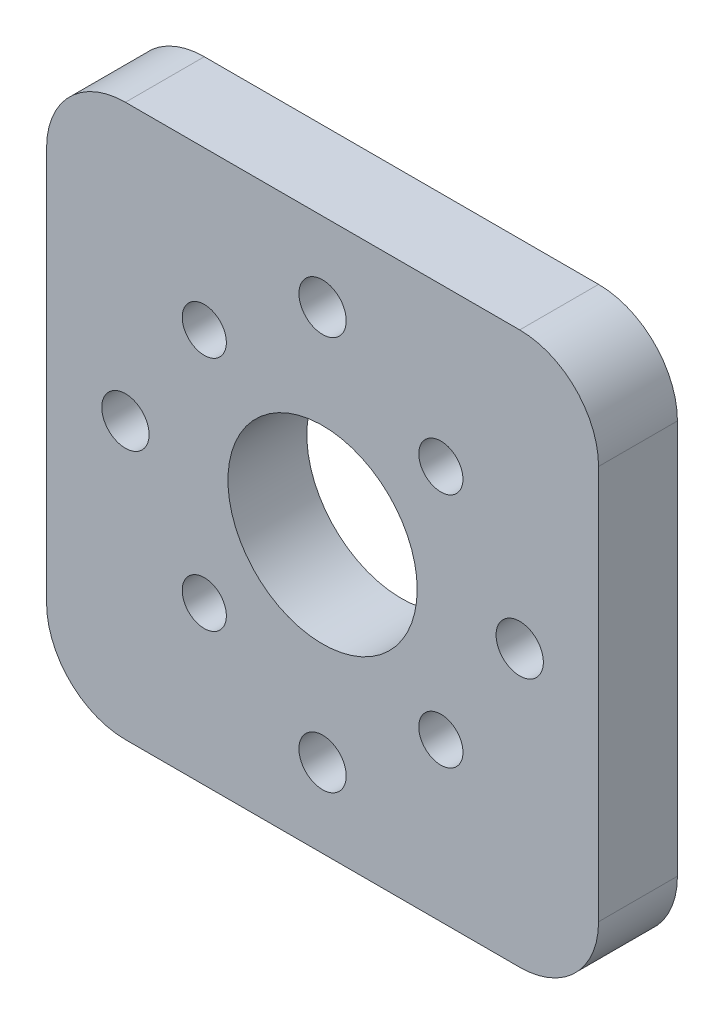
ISO-10303-21;
HEADER;
FILE_DESCRIPTION(('STEP AP214'),'2;1');
FILE_NAME('part.step','',(''),(''),'','','');
FILE_SCHEMA(('AUTOMOTIVE_DESIGN { 1 0 10303 214 1 1 1 1 }'));
ENDSEC;
DATA;
#1=APPLICATION_CONTEXT('core data for automotive mechanical design processes');
#2=APPLICATION_PROTOCOL_DEFINITION('international standard','automotive_design',2000,#1);
#3=PRODUCT_CONTEXT('',#1,'mechanical');
#4=PRODUCT('Part','Part','',(#3));
#5=PRODUCT_RELATED_PRODUCT_CATEGORY('part','',(#4));
#6=PRODUCT_DEFINITION_FORMATION('','',#4);
#7=PRODUCT_DEFINITION_CONTEXT('part definition',#1,'design');
#8=PRODUCT_DEFINITION('design','',#6,#7);
#9=PRODUCT_DEFINITION_SHAPE('','',#8);
#10=(LENGTH_UNIT() NAMED_UNIT(*) SI_UNIT(.MILLI.,.METRE.));
#11=(NAMED_UNIT(*) PLANE_ANGLE_UNIT() SI_UNIT($,.RADIAN.));
#12=(NAMED_UNIT(*) SI_UNIT($,.STERADIAN.) SOLID_ANGLE_UNIT());
#13=UNCERTAINTY_MEASURE_WITH_UNIT(LENGTH_MEASURE(1.E-05),#10,'distance_accuracy_value','');
#14=(GEOMETRIC_REPRESENTATION_CONTEXT(3) GLOBAL_UNCERTAINTY_ASSIGNED_CONTEXT((#13)) GLOBAL_UNIT_ASSIGNED_CONTEXT((#10,
#11,#12)) REPRESENTATION_CONTEXT('',''));
#15=CARTESIAN_POINT('',(0.,0.,0.));
#16=DIRECTION('',(0.,0.,1.));
#17=DIRECTION('',(1.,0.,0.));
#18=AXIS2_PLACEMENT_3D('',#15,#16,#17);
#19=CARTESIAN_POINT('',(0.,0.,5.));
#20=DIRECTION('',(0.,0.,1.));
#21=DIRECTION('',(1.,0.,0.));
#22=AXIS2_PLACEMENT_3D('',#19,#20,#21);
#23=PLANE('',#22);
#24=CARTESIAN_POINT('',(7.5,-7.5,5.));
#25=DIRECTION('',(0.,0.,1.));
#26=DIRECTION('',(1.,0.,0.));
#27=AXIS2_PLACEMENT_3D('',#24,#25,#26);
#28=CIRCLE('',#27,1.4);
#29=CARTESIAN_POINT('',(8.9,-7.5,5.));
#30=VERTEX_POINT('',#29);
#31=EDGE_CURVE('E222',#30,#30,#28,.T.);
#32=ORIENTED_EDGE('',*,*,#31,.F.);
#33=EDGE_LOOP('',(#32));
#34=FACE_BOUND('',#33,.T.);
#35=CARTESIAN_POINT('',(-7.5,7.5,5.));
#36=DIRECTION('',(0.,0.,1.));
#37=DIRECTION('',(1.,0.,0.));
#38=AXIS2_PLACEMENT_3D('',#35,#36,#37);
#39=CIRCLE('',#38,1.4);
#40=CARTESIAN_POINT('',(-6.1,7.5,5.));
#41=VERTEX_POINT('',#40);
#42=EDGE_CURVE('E210',#41,#41,#39,.T.);
#43=ORIENTED_EDGE('',*,*,#42,.F.);
#44=EDGE_LOOP('',(#43));
#45=FACE_BOUND('',#44,.T.);
#46=CARTESIAN_POINT('',(-12.5,0.,5.));
#47=DIRECTION('',(0.,0.,1.));
#48=DIRECTION('',(1.,0.,0.));
#49=AXIS2_PLACEMENT_3D('',#46,#47,#48);
#50=CIRCLE('',#49,1.5);
#51=CARTESIAN_POINT('',(-11.,0.,5.));
#52=VERTEX_POINT('',#51);
#53=EDGE_CURVE('E198',#52,#52,#50,.T.);
#54=ORIENTED_EDGE('',*,*,#53,.F.);
#55=EDGE_LOOP('',(#54));
#56=FACE_BOUND('',#55,.T.);
#57=CARTESIAN_POINT('',(12.5,0.,5.));
#58=DIRECTION('',(0.,0.,1.));
#59=DIRECTION('',(1.,0.,0.));
#60=AXIS2_PLACEMENT_3D('',#57,#58,#59);
#61=CIRCLE('',#60,1.5);
#62=CARTESIAN_POINT('',(14.,0.,5.));
#63=VERTEX_POINT('',#62);
#64=EDGE_CURVE('E187',#63,#63,#61,.T.);
#65=ORIENTED_EDGE('',*,*,#64,.F.);
#66=EDGE_LOOP('',(#65));
#67=FACE_BOUND('',#66,.T.);
#68=DIRECTION('',(1.,0.,0.));
#69=VECTOR('',#68,1.);
#70=CARTESIAN_POINT('',(-17.5,-17.5,5.));
#71=LINE('',#70,#69);
#72=CARTESIAN_POINT('',(-12.5,-17.5,5.));
#73=VERTEX_POINT('',#72);
#74=CARTESIAN_POINT('',(12.5,-17.5,5.));
#75=VERTEX_POINT('',#74);
#76=EDGE_CURVE('E143',#73,#75,#71,.T.);
#77=ORIENTED_EDGE('',*,*,#76,.T.);
#78=CARTESIAN_POINT('',(12.5,-12.5,5.));
#79=DIRECTION('',(0.,0.,1.));
#80=DIRECTION('',(1.,0.,0.));
#81=AXIS2_PLACEMENT_3D('',#78,#79,#80);
#82=CIRCLE('',#81,5.);
#83=CARTESIAN_POINT('',(17.5,-12.5,5.));
#84=VERTEX_POINT('',#83);
#85=EDGE_CURVE('E161',#75,#84,#82,.T.);
#86=ORIENTED_EDGE('',*,*,#85,.T.);
#87=DIRECTION('',(0.,1.,0.));
#88=VECTOR('',#87,1.);
#89=CARTESIAN_POINT('',(17.5,17.5,5.));
#90=LINE('',#89,#88);
#91=CARTESIAN_POINT('',(17.5,12.5,5.));
#92=VERTEX_POINT('',#91);
#93=EDGE_CURVE('E125',#84,#92,#90,.T.);
#94=ORIENTED_EDGE('',*,*,#93,.T.);
#95=CARTESIAN_POINT('',(12.5,12.5,5.));
#96=DIRECTION('',(0.,0.,1.));
#97=DIRECTION('',(1.,0.,0.));
#98=AXIS2_PLACEMENT_3D('',#95,#96,#97);
#99=CIRCLE('',#98,5.);
#100=CARTESIAN_POINT('',(12.5,17.5,5.));
#101=VERTEX_POINT('',#100);
#102=EDGE_CURVE('E158',#92,#101,#99,.T.);
#103=ORIENTED_EDGE('',*,*,#102,.T.);
#104=DIRECTION('',(-1.,0.,0.));
#105=VECTOR('',#104,1.);
#106=CARTESIAN_POINT('',(-17.5,17.5,5.));
#107=LINE('',#106,#105);
#108=CARTESIAN_POINT('',(-12.5,17.5,5.));
#109=VERTEX_POINT('',#108);
#110=EDGE_CURVE('E172',#101,#109,#107,.T.);
#111=ORIENTED_EDGE('',*,*,#110,.T.);
#112=CARTESIAN_POINT('',(-12.5,12.5,5.));
#113=DIRECTION('',(0.,0.,1.));
#114=DIRECTION('',(1.,0.,0.));
#115=AXIS2_PLACEMENT_3D('',#112,#113,#114);
#116=CIRCLE('',#115,5.);
#117=CARTESIAN_POINT('',(-17.5,12.5,5.));
#118=VERTEX_POINT('',#117);
#119=EDGE_CURVE('E61',#109,#118,#116,.T.);
#120=ORIENTED_EDGE('',*,*,#119,.T.);
#121=DIRECTION('',(0.,-1.,0.));
#122=VECTOR('',#121,1.);
#123=CARTESIAN_POINT('',(-17.5,17.5,5.));
#124=LINE('',#123,#122);
#125=CARTESIAN_POINT('',(-17.5,-12.5,5.));
#126=VERTEX_POINT('',#125);
#127=EDGE_CURVE('E180',#118,#126,#124,.T.);
#128=ORIENTED_EDGE('',*,*,#127,.T.);
#129=CARTESIAN_POINT('',(-12.5,-12.5,5.));
#130=DIRECTION('',(0.,0.,1.));
#131=DIRECTION('',(1.,0.,0.));
#132=AXIS2_PLACEMENT_3D('',#129,#130,#131);
#133=CIRCLE('',#132,5.);
#134=EDGE_CURVE('E156',#126,#73,#133,.T.);
#135=ORIENTED_EDGE('',*,*,#134,.T.);
#136=EDGE_LOOP('',(#77,#86,#94,#103,#111,#120,#128,#135));
#137=FACE_BOUND('',#136,.T.);
#138=CARTESIAN_POINT('',(0.,12.5,5.));
#139=DIRECTION('',(0.,0.,1.));
#140=DIRECTION('',(1.,0.,0.));
#141=AXIS2_PLACEMENT_3D('',#138,#139,#140);
#142=CIRCLE('',#141,1.5);
#143=CARTESIAN_POINT('',(1.5,12.5,5.));
#144=VERTEX_POINT('',#143);
#145=EDGE_CURVE('E134',#144,#144,#142,.T.);
#146=ORIENTED_EDGE('',*,*,#145,.F.);
#147=EDGE_LOOP('',(#146));
#148=FACE_BOUND('',#147,.T.);
#149=CARTESIAN_POINT('',(0.,-12.5,5.));
#150=DIRECTION('',(0.,0.,1.));
#151=DIRECTION('',(1.,0.,0.));
#152=AXIS2_PLACEMENT_3D('',#149,#150,#151);
#153=CIRCLE('',#152,1.5);
#154=CARTESIAN_POINT('',(1.5,-12.5,5.));
#155=VERTEX_POINT('',#154);
#156=EDGE_CURVE('E192',#155,#155,#153,.T.);
#157=ORIENTED_EDGE('',*,*,#156,.F.);
#158=EDGE_LOOP('',(#157));
#159=FACE_BOUND('',#158,.T.);
#160=CARTESIAN_POINT('',(0.,0.,5.));
#161=DIRECTION('',(0.,0.,1.));
#162=DIRECTION('',(1.,0.,0.));
#163=AXIS2_PLACEMENT_3D('',#160,#161,#162);
#164=CIRCLE('',#163,6.);
#165=CARTESIAN_POINT('',(6.,0.,5.));
#166=VERTEX_POINT('',#165);
#167=EDGE_CURVE('E204',#166,#166,#164,.T.);
#168=ORIENTED_EDGE('',*,*,#167,.F.);
#169=EDGE_LOOP('',(#168));
#170=FACE_BOUND('',#169,.T.);
#171=CARTESIAN_POINT('',(7.5,7.5,5.));
#172=DIRECTION('',(0.,0.,1.));
#173=DIRECTION('',(1.,0.,0.));
#174=AXIS2_PLACEMENT_3D('',#171,#172,#173);
#175=CIRCLE('',#174,1.4);
#176=CARTESIAN_POINT('',(8.9,7.5,5.));
#177=VERTEX_POINT('',#176);
#178=EDGE_CURVE('E216',#177,#177,#175,.T.);
#179=ORIENTED_EDGE('',*,*,#178,.F.);
#180=EDGE_LOOP('',(#179));
#181=FACE_BOUND('',#180,.T.);
#182=CARTESIAN_POINT('',(-7.5,-7.5,5.));
#183=DIRECTION('',(0.,0.,1.));
#184=DIRECTION('',(1.,0.,0.));
#185=AXIS2_PLACEMENT_3D('',#182,#183,#184);
#186=CIRCLE('',#185,1.4);
#187=CARTESIAN_POINT('',(-6.1,-7.5,5.));
#188=VERTEX_POINT('',#187);
#189=EDGE_CURVE('E228',#188,#188,#186,.T.);
#190=ORIENTED_EDGE('',*,*,#189,.F.);
#191=EDGE_LOOP('',(#190));
#192=FACE_BOUND('',#191,.T.);
#193=ADVANCED_FACE('F39',(#34,#45,#56,#67,#137,#148,#159,#170,#181,#192),#23,.T.);
#194=CARTESIAN_POINT('',(0.,0.,0.));
#195=DIRECTION('',(0.,0.,1.));
#196=DIRECTION('',(1.,0.,0.));
#197=AXIS2_PLACEMENT_3D('',#194,#195,#196);
#198=PLANE('',#197);
#199=DIRECTION('',(0.,1.,0.));
#200=VECTOR('',#199,1.);
#201=CARTESIAN_POINT('',(17.5,17.5,0.));
#202=LINE('',#201,#200);
#203=CARTESIAN_POINT('',(17.5,-12.5,0.));
#204=VERTEX_POINT('',#203);
#205=CARTESIAN_POINT('',(17.5,12.5,0.));
#206=VERTEX_POINT('',#205);
#207=EDGE_CURVE('E122',#204,#206,#202,.T.);
#208=ORIENTED_EDGE('',*,*,#207,.F.);
#209=CARTESIAN_POINT('',(12.5,-12.5,0.));
#210=DIRECTION('',(0.,0.,1.));
#211=DIRECTION('',(1.,0.,0.));
#212=AXIS2_PLACEMENT_3D('',#209,#210,#211);
#213=CIRCLE('',#212,5.);
#214=CARTESIAN_POINT('',(12.5,-17.5,0.));
#215=VERTEX_POINT('',#214);
#216=EDGE_CURVE('E105',#204,#215,#213,.F.);
#217=ORIENTED_EDGE('',*,*,#216,.T.);
#218=DIRECTION('',(1.,0.,0.));
#219=VECTOR('',#218,1.);
#220=CARTESIAN_POINT('',(-17.5,-17.5,0.));
#221=LINE('',#220,#219);
#222=CARTESIAN_POINT('',(-12.5,-17.5,0.));
#223=VERTEX_POINT('',#222);
#224=EDGE_CURVE('E147',#223,#215,#221,.T.);
#225=ORIENTED_EDGE('',*,*,#224,.F.);
#226=CARTESIAN_POINT('',(-12.5,-12.5,0.));
#227=DIRECTION('',(0.,0.,1.));
#228=DIRECTION('',(1.,0.,0.));
#229=AXIS2_PLACEMENT_3D('',#226,#227,#228);
#230=CIRCLE('',#229,5.);
#231=CARTESIAN_POINT('',(-17.5,-12.5,0.));
#232=VERTEX_POINT('',#231);
#233=EDGE_CURVE('E126',#223,#232,#230,.F.);
#234=ORIENTED_EDGE('',*,*,#233,.T.);
#235=DIRECTION('',(0.,-1.,0.));
#236=VECTOR('',#235,1.);
#237=CARTESIAN_POINT('',(-17.5,17.5,0.));
#238=LINE('',#237,#236);
#239=CARTESIAN_POINT('',(-17.5,12.5,0.));
#240=VERTEX_POINT('',#239);
#241=EDGE_CURVE('E137',#240,#232,#238,.T.);
#242=ORIENTED_EDGE('',*,*,#241,.F.);
#243=CARTESIAN_POINT('',(-12.5,12.5,0.));
#244=DIRECTION('',(0.,0.,1.));
#245=DIRECTION('',(1.,0.,0.));
#246=AXIS2_PLACEMENT_3D('',#243,#244,#245);
#247=CIRCLE('',#246,5.);
#248=CARTESIAN_POINT('',(-12.5,17.5,0.));
#249=VERTEX_POINT('',#248);
#250=EDGE_CURVE('E116',#240,#249,#247,.F.);
#251=ORIENTED_EDGE('',*,*,#250,.T.);
#252=DIRECTION('',(-1.,0.,0.));
#253=VECTOR('',#252,1.);
#254=CARTESIAN_POINT('',(-17.5,17.5,0.));
#255=LINE('',#254,#253);
#256=CARTESIAN_POINT('',(12.5,17.5,0.));
#257=VERTEX_POINT('',#256);
#258=EDGE_CURVE('E133',#257,#249,#255,.T.);
#259=ORIENTED_EDGE('',*,*,#258,.F.);
#260=CARTESIAN_POINT('',(12.5,12.5,0.));
#261=DIRECTION('',(0.,0.,1.));
#262=DIRECTION('',(1.,0.,0.));
#263=AXIS2_PLACEMENT_3D('',#260,#261,#262);
#264=CIRCLE('',#263,5.);
#265=EDGE_CURVE('E132',#257,#206,#264,.F.);
#266=ORIENTED_EDGE('',*,*,#265,.T.);
#267=EDGE_LOOP('',(#208,#217,#225,#234,#242,#251,#259,#266));
#268=FACE_BOUND('',#267,.T.);
#269=CARTESIAN_POINT('',(0.,12.5,0.));
#270=DIRECTION('',(0.,0.,1.));
#271=DIRECTION('',(1.,0.,0.));
#272=AXIS2_PLACEMENT_3D('',#269,#270,#271);
#273=CIRCLE('',#272,1.5);
#274=CARTESIAN_POINT('',(1.5,12.5,0.));
#275=VERTEX_POINT('',#274);
#276=EDGE_CURVE('E140',#275,#275,#273,.T.);
#277=ORIENTED_EDGE('',*,*,#276,.T.);
#278=EDGE_LOOP('',(#277));
#279=FACE_BOUND('',#278,.T.);
#280=CARTESIAN_POINT('',(12.5,0.,0.));
#281=DIRECTION('',(0.,0.,1.));
#282=DIRECTION('',(1.,0.,0.));
#283=AXIS2_PLACEMENT_3D('',#280,#281,#282);
#284=CIRCLE('',#283,1.5);
#285=CARTESIAN_POINT('',(14.,0.,0.));
#286=VERTEX_POINT('',#285);
#287=EDGE_CURVE('E189',#286,#286,#284,.T.);
#288=ORIENTED_EDGE('',*,*,#287,.T.);
#289=EDGE_LOOP('',(#288));
#290=FACE_BOUND('',#289,.T.);
#291=CARTESIAN_POINT('',(0.,-12.5,0.));
#292=DIRECTION('',(0.,0.,1.));
#293=DIRECTION('',(1.,0.,0.));
#294=AXIS2_PLACEMENT_3D('',#291,#292,#293);
#295=CIRCLE('',#294,1.5);
#296=CARTESIAN_POINT('',(1.5,-12.5,0.));
#297=VERTEX_POINT('',#296);
#298=EDGE_CURVE('E195',#297,#297,#295,.T.);
#299=ORIENTED_EDGE('',*,*,#298,.T.);
#300=EDGE_LOOP('',(#299));
#301=FACE_BOUND('',#300,.T.);
#302=CARTESIAN_POINT('',(-12.5,0.,0.));
#303=DIRECTION('',(0.,0.,1.));
#304=DIRECTION('',(1.,0.,0.));
#305=AXIS2_PLACEMENT_3D('',#302,#303,#304);
#306=CIRCLE('',#305,1.5);
#307=CARTESIAN_POINT('',(-11.,0.,0.));
#308=VERTEX_POINT('',#307);
#309=EDGE_CURVE('E201',#308,#308,#306,.T.);
#310=ORIENTED_EDGE('',*,*,#309,.T.);
#311=EDGE_LOOP('',(#310));
#312=FACE_BOUND('',#311,.T.);
#313=CARTESIAN_POINT('',(0.,0.,0.));
#314=DIRECTION('',(0.,0.,1.));
#315=DIRECTION('',(1.,0.,0.));
#316=AXIS2_PLACEMENT_3D('',#313,#314,#315);
#317=CIRCLE('',#316,6.);
#318=CARTESIAN_POINT('',(6.,0.,0.));
#319=VERTEX_POINT('',#318);
#320=EDGE_CURVE('E207',#319,#319,#317,.T.);
#321=ORIENTED_EDGE('',*,*,#320,.T.);
#322=EDGE_LOOP('',(#321));
#323=FACE_BOUND('',#322,.T.);
#324=CARTESIAN_POINT('',(-7.5,7.5,0.));
#325=DIRECTION('',(0.,0.,1.));
#326=DIRECTION('',(1.,0.,0.));
#327=AXIS2_PLACEMENT_3D('',#324,#325,#326);
#328=CIRCLE('',#327,1.4);
#329=CARTESIAN_POINT('',(-6.1,7.5,0.));
#330=VERTEX_POINT('',#329);
#331=EDGE_CURVE('E213',#330,#330,#328,.T.);
#332=ORIENTED_EDGE('',*,*,#331,.T.);
#333=EDGE_LOOP('',(#332));
#334=FACE_BOUND('',#333,.T.);
#335=CARTESIAN_POINT('',(7.5,7.5,0.));
#336=DIRECTION('',(0.,0.,1.));
#337=DIRECTION('',(1.,0.,0.));
#338=AXIS2_PLACEMENT_3D('',#335,#336,#337);
#339=CIRCLE('',#338,1.4);
#340=CARTESIAN_POINT('',(8.9,7.5,0.));
#341=VERTEX_POINT('',#340);
#342=EDGE_CURVE('E219',#341,#341,#339,.T.);
#343=ORIENTED_EDGE('',*,*,#342,.T.);
#344=EDGE_LOOP('',(#343));
#345=FACE_BOUND('',#344,.T.);
#346=CARTESIAN_POINT('',(7.5,-7.5,0.));
#347=DIRECTION('',(0.,0.,1.));
#348=DIRECTION('',(1.,0.,0.));
#349=AXIS2_PLACEMENT_3D('',#346,#347,#348);
#350=CIRCLE('',#349,1.4);
#351=CARTESIAN_POINT('',(8.9,-7.5,0.));
#352=VERTEX_POINT('',#351);
#353=EDGE_CURVE('E225',#352,#352,#350,.T.);
#354=ORIENTED_EDGE('',*,*,#353,.T.);
#355=EDGE_LOOP('',(#354));
#356=FACE_BOUND('',#355,.T.);
#357=CARTESIAN_POINT('',(-7.5,-7.5,0.));
#358=DIRECTION('',(0.,0.,1.));
#359=DIRECTION('',(1.,0.,0.));
#360=AXIS2_PLACEMENT_3D('',#357,#358,#359);
#361=CIRCLE('',#360,1.4);
#362=CARTESIAN_POINT('',(-6.1,-7.5,0.));
#363=VERTEX_POINT('',#362);
#364=EDGE_CURVE('E231',#363,#363,#361,.T.);
#365=ORIENTED_EDGE('',*,*,#364,.T.);
#366=EDGE_LOOP('',(#365));
#367=FACE_BOUND('',#366,.T.);
#368=ADVANCED_FACE('F129',(#268,#279,#290,#301,#312,#323,#334,#345,#356,#367),#198,.F.);
#369=CARTESIAN_POINT('',(17.5,17.5,5.));
#370=DIRECTION('',(-1.,0.,0.));
#371=DIRECTION('',(0.,-1.,0.));
#372=AXIS2_PLACEMENT_3D('',#369,#370,#371);
#373=PLANE('',#372);
#374=ORIENTED_EDGE('',*,*,#93,.F.);
#375=DIRECTION('',(0.,0.,-1.));
#376=VECTOR('',#375,1.);
#377=CARTESIAN_POINT('',(17.5,-12.5,5.));
#378=LINE('',#377,#376);
#379=EDGE_CURVE('E109',#84,#204,#378,.T.);
#380=ORIENTED_EDGE('',*,*,#379,.T.);
#381=ORIENTED_EDGE('',*,*,#207,.T.);
#382=DIRECTION('',(0.,0.,-1.));
#383=VECTOR('',#382,1.);
#384=CARTESIAN_POINT('',(17.5,12.5,5.));
#385=LINE('',#384,#383);
#386=EDGE_CURVE('E127',#206,#92,#385,.F.);
#387=ORIENTED_EDGE('',*,*,#386,.T.);
#388=EDGE_LOOP('',(#374,#380,#381,#387));
#389=FACE_BOUND('',#388,.T.);
#390=ADVANCED_FACE('F121',(#389),#373,.F.);
#391=CARTESIAN_POINT('',(-17.5,17.5,5.));
#392=DIRECTION('',(0.,-1.,0.));
#393=DIRECTION('',(0.,0.,-1.));
#394=AXIS2_PLACEMENT_3D('',#391,#392,#393);
#395=PLANE('',#394);
#396=ORIENTED_EDGE('',*,*,#258,.T.);
#397=DIRECTION('',(0.,0.,-1.));
#398=VECTOR('',#397,1.);
#399=CARTESIAN_POINT('',(-12.5,17.5,5.));
#400=LINE('',#399,#398);
#401=EDGE_CURVE('E11',#249,#109,#400,.F.);
#402=ORIENTED_EDGE('',*,*,#401,.T.);
#403=ORIENTED_EDGE('',*,*,#110,.F.);
#404=DIRECTION('',(0.,0.,-1.));
#405=VECTOR('',#404,1.);
#406=CARTESIAN_POINT('',(12.5,17.5,5.));
#407=LINE('',#406,#405);
#408=EDGE_CURVE('E47',#101,#257,#407,.T.);
#409=ORIENTED_EDGE('',*,*,#408,.T.);
#410=EDGE_LOOP('',(#396,#402,#403,#409));
#411=FACE_BOUND('',#410,.T.);
#412=ADVANCED_FACE('F170',(#411),#395,.F.);
#413=CARTESIAN_POINT('',(-17.5,17.5,5.));
#414=DIRECTION('',(1.,0.,0.));
#415=DIRECTION('',(0.,1.,0.));
#416=AXIS2_PLACEMENT_3D('',#413,#414,#415);
#417=PLANE('',#416);
#418=ORIENTED_EDGE('',*,*,#127,.F.);
#419=DIRECTION('',(0.,0.,-1.));
#420=VECTOR('',#419,1.);
#421=CARTESIAN_POINT('',(-17.5,12.5,5.));
#422=LINE('',#421,#420);
#423=EDGE_CURVE('E164',#118,#240,#422,.T.);
#424=ORIENTED_EDGE('',*,*,#423,.T.);
#425=ORIENTED_EDGE('',*,*,#241,.T.);
#426=DIRECTION('',(0.,0.,-1.));
#427=VECTOR('',#426,1.);
#428=CARTESIAN_POINT('',(-17.5,-12.5,5.));
#429=LINE('',#428,#427);
#430=EDGE_CURVE('E54',#232,#126,#429,.F.);
#431=ORIENTED_EDGE('',*,*,#430,.T.);
#432=EDGE_LOOP('',(#418,#424,#425,#431));
#433=FACE_BOUND('',#432,.T.);
#434=ADVANCED_FACE('F179',(#433),#417,.F.);
#435=CARTESIAN_POINT('',(-17.5,-17.5,5.));
#436=DIRECTION('',(0.,1.,0.));
#437=DIRECTION('',(0.,0.,1.));
#438=AXIS2_PLACEMENT_3D('',#435,#436,#437);
#439=PLANE('',#438);
#440=ORIENTED_EDGE('',*,*,#224,.T.);
#441=DIRECTION('',(0.,0.,-1.));
#442=VECTOR('',#441,1.);
#443=CARTESIAN_POINT('',(12.5,-17.5,5.));
#444=LINE('',#443,#442);
#445=EDGE_CURVE('E110',#215,#75,#444,.F.);
#446=ORIENTED_EDGE('',*,*,#445,.T.);
#447=ORIENTED_EDGE('',*,*,#76,.F.);
#448=DIRECTION('',(0.,0.,-1.));
#449=VECTOR('',#448,1.);
#450=CARTESIAN_POINT('',(-12.5,-17.5,5.));
#451=LINE('',#450,#449);
#452=EDGE_CURVE('E115',#73,#223,#451,.T.);
#453=ORIENTED_EDGE('',*,*,#452,.T.);
#454=EDGE_LOOP('',(#440,#446,#447,#453));
#455=FACE_BOUND('',#454,.T.);
#456=ADVANCED_FACE('F253',(#455),#439,.F.);
#457=CARTESIAN_POINT('',(0.,12.5,5.));
#458=DIRECTION('',(0.,0.,-1.));
#459=DIRECTION('',(-1.,0.,0.));
#460=AXIS2_PLACEMENT_3D('',#457,#458,#459);
#461=CYLINDRICAL_SURFACE('',#460,1.5);
#462=ORIENTED_EDGE('',*,*,#145,.T.);
#463=EDGE_LOOP('',(#462));
#464=FACE_BOUND('',#463,.T.);
#465=ORIENTED_EDGE('',*,*,#276,.F.);
#466=EDGE_LOOP('',(#465));
#467=FACE_BOUND('',#466,.T.);
#468=ADVANCED_FACE('F250',(#464,#467),#461,.F.);
#469=CARTESIAN_POINT('',(12.5,0.,5.));
#470=DIRECTION('',(0.,0.,-1.));
#471=DIRECTION('',(-1.,0.,0.));
#472=AXIS2_PLACEMENT_3D('',#469,#470,#471);
#473=CYLINDRICAL_SURFACE('',#472,1.5);
#474=ORIENTED_EDGE('',*,*,#64,.T.);
#475=EDGE_LOOP('',(#474));
#476=FACE_BOUND('',#475,.T.);
#477=ORIENTED_EDGE('',*,*,#287,.F.);
#478=EDGE_LOOP('',(#477));
#479=FACE_BOUND('',#478,.T.);
#480=ADVANCED_FACE('F316',(#476,#479),#473,.F.);
#481=CARTESIAN_POINT('',(0.,-12.5,5.));
#482=DIRECTION('',(0.,0.,-1.));
#483=DIRECTION('',(-1.,0.,0.));
#484=AXIS2_PLACEMENT_3D('',#481,#482,#483);
#485=CYLINDRICAL_SURFACE('',#484,1.5);
#486=ORIENTED_EDGE('',*,*,#156,.T.);
#487=EDGE_LOOP('',(#486));
#488=FACE_BOUND('',#487,.T.);
#489=ORIENTED_EDGE('',*,*,#298,.F.);
#490=EDGE_LOOP('',(#489));
#491=FACE_BOUND('',#490,.T.);
#492=ADVANCED_FACE('F313',(#488,#491),#485,.F.);
#493=CARTESIAN_POINT('',(-12.5,0.,5.));
#494=DIRECTION('',(0.,0.,-1.));
#495=DIRECTION('',(-1.,0.,0.));
#496=AXIS2_PLACEMENT_3D('',#493,#494,#495);
#497=CYLINDRICAL_SURFACE('',#496,1.5);
#498=ORIENTED_EDGE('',*,*,#53,.T.);
#499=EDGE_LOOP('',(#498));
#500=FACE_BOUND('',#499,.T.);
#501=ORIENTED_EDGE('',*,*,#309,.F.);
#502=EDGE_LOOP('',(#501));
#503=FACE_BOUND('',#502,.T.);
#504=ADVANCED_FACE('F309',(#500,#503),#497,.F.);
#505=CARTESIAN_POINT('',(0.,0.,5.));
#506=DIRECTION('',(0.,0.,-1.));
#507=DIRECTION('',(-1.,0.,0.));
#508=AXIS2_PLACEMENT_3D('',#505,#506,#507);
#509=CYLINDRICAL_SURFACE('',#508,6.);
#510=ORIENTED_EDGE('',*,*,#167,.T.);
#511=EDGE_LOOP('',(#510));
#512=FACE_BOUND('',#511,.T.);
#513=ORIENTED_EDGE('',*,*,#320,.F.);
#514=EDGE_LOOP('',(#513));
#515=FACE_BOUND('',#514,.T.);
#516=ADVANCED_FACE('F305',(#512,#515),#509,.F.);
#517=CARTESIAN_POINT('',(-7.5,7.5,5.));
#518=DIRECTION('',(0.,0.,-1.));
#519=DIRECTION('',(-1.,0.,0.));
#520=AXIS2_PLACEMENT_3D('',#517,#518,#519);
#521=CYLINDRICAL_SURFACE('',#520,1.4);
#522=ORIENTED_EDGE('',*,*,#42,.T.);
#523=EDGE_LOOP('',(#522));
#524=FACE_BOUND('',#523,.T.);
#525=ORIENTED_EDGE('',*,*,#331,.F.);
#526=EDGE_LOOP('',(#525));
#527=FACE_BOUND('',#526,.T.);
#528=ADVANCED_FACE('F287',(#524,#527),#521,.F.);
#529=CARTESIAN_POINT('',(7.5,7.5,5.));
#530=DIRECTION('',(0.,0.,-1.));
#531=DIRECTION('',(-1.,0.,0.));
#532=AXIS2_PLACEMENT_3D('',#529,#530,#531);
#533=CYLINDRICAL_SURFACE('',#532,1.4);
#534=ORIENTED_EDGE('',*,*,#178,.T.);
#535=EDGE_LOOP('',(#534));
#536=FACE_BOUND('',#535,.T.);
#537=ORIENTED_EDGE('',*,*,#342,.F.);
#538=EDGE_LOOP('',(#537));
#539=FACE_BOUND('',#538,.T.);
#540=ADVANCED_FACE('F283',(#536,#539),#533,.F.);
#541=CARTESIAN_POINT('',(7.5,-7.5,5.));
#542=DIRECTION('',(0.,0.,-1.));
#543=DIRECTION('',(-1.,0.,0.));
#544=AXIS2_PLACEMENT_3D('',#541,#542,#543);
#545=CYLINDRICAL_SURFACE('',#544,1.4);
#546=ORIENTED_EDGE('',*,*,#31,.T.);
#547=EDGE_LOOP('',(#546));
#548=FACE_BOUND('',#547,.T.);
#549=ORIENTED_EDGE('',*,*,#353,.F.);
#550=EDGE_LOOP('',(#549));
#551=FACE_BOUND('',#550,.T.);
#552=ADVANCED_FACE('F286',(#548,#551),#545,.F.);
#553=CARTESIAN_POINT('',(-7.5,-7.5,5.));
#554=DIRECTION('',(0.,0.,-1.));
#555=DIRECTION('',(-1.,0.,0.));
#556=AXIS2_PLACEMENT_3D('',#553,#554,#555);
#557=CYLINDRICAL_SURFACE('',#556,1.4);
#558=ORIENTED_EDGE('',*,*,#189,.T.);
#559=EDGE_LOOP('',(#558));
#560=FACE_BOUND('',#559,.T.);
#561=ORIENTED_EDGE('',*,*,#364,.F.);
#562=EDGE_LOOP('',(#561));
#563=FACE_BOUND('',#562,.T.);
#564=ADVANCED_FACE('F237',(#560,#563),#557,.F.);
#565=CARTESIAN_POINT('',(12.5,-12.5,5.));
#566=DIRECTION('',(0.,0.,-1.));
#567=DIRECTION('',(-1.,0.,0.));
#568=AXIS2_PLACEMENT_3D('',#565,#566,#567);
#569=CYLINDRICAL_SURFACE('',#568,5.);
#570=ORIENTED_EDGE('',*,*,#85,.F.);
#571=ORIENTED_EDGE('',*,*,#445,.F.);
#572=ORIENTED_EDGE('',*,*,#216,.F.);
#573=ORIENTED_EDGE('',*,*,#379,.F.);
#574=EDGE_LOOP('',(#570,#571,#572,#573));
#575=FACE_BOUND('',#574,.T.);
#576=ADVANCED_FACE('F108',(#575),#569,.T.);
#577=CARTESIAN_POINT('',(-12.5,12.5,5.));
#578=DIRECTION('',(0.,0.,-1.));
#579=DIRECTION('',(-1.,0.,0.));
#580=AXIS2_PLACEMENT_3D('',#577,#578,#579);
#581=CYLINDRICAL_SURFACE('',#580,5.);
#582=ORIENTED_EDGE('',*,*,#119,.F.);
#583=ORIENTED_EDGE('',*,*,#401,.F.);
#584=ORIENTED_EDGE('',*,*,#250,.F.);
#585=ORIENTED_EDGE('',*,*,#423,.F.);
#586=EDGE_LOOP('',(#582,#583,#584,#585));
#587=FACE_BOUND('',#586,.T.);
#588=ADVANCED_FACE('F178',(#587),#581,.T.);
#589=CARTESIAN_POINT('',(12.5,12.5,5.));
#590=DIRECTION('',(0.,0.,-1.));
#591=DIRECTION('',(-1.,0.,0.));
#592=AXIS2_PLACEMENT_3D('',#589,#590,#591);
#593=CYLINDRICAL_SURFACE('',#592,5.);
#594=ORIENTED_EDGE('',*,*,#102,.F.);
#595=ORIENTED_EDGE('',*,*,#386,.F.);
#596=ORIENTED_EDGE('',*,*,#265,.F.);
#597=ORIENTED_EDGE('',*,*,#408,.F.);
#598=EDGE_LOOP('',(#594,#595,#596,#597));
#599=FACE_BOUND('',#598,.T.);
#600=ADVANCED_FACE('F266',(#599),#593,.T.);
#601=CARTESIAN_POINT('',(-12.5,-12.5,5.));
#602=DIRECTION('',(0.,0.,-1.));
#603=DIRECTION('',(-1.,0.,0.));
#604=AXIS2_PLACEMENT_3D('',#601,#602,#603);
#605=CYLINDRICAL_SURFACE('',#604,5.);
#606=ORIENTED_EDGE('',*,*,#134,.F.);
#607=ORIENTED_EDGE('',*,*,#430,.F.);
#608=ORIENTED_EDGE('',*,*,#233,.F.);
#609=ORIENTED_EDGE('',*,*,#452,.F.);
#610=EDGE_LOOP('',(#606,#607,#608,#609));
#611=FACE_BOUND('',#610,.T.);
#612=ADVANCED_FACE('F41',(#611),#605,.T.);
#613=CLOSED_SHELL('',(#193,#368,#390,#412,#434,#456,#468,#480,#492,#504,#516,#528,#540,#552,
#564,#576,#588,#600,#612));
#614=MANIFOLD_SOLID_BREP('B2',#613);
#615=ADVANCED_BREP_SHAPE_REPRESENTATION('',(#18,#614),#14);
#616=SHAPE_DEFINITION_REPRESENTATION(#9,#615);
ENDSEC;
END-ISO-10303-21;
